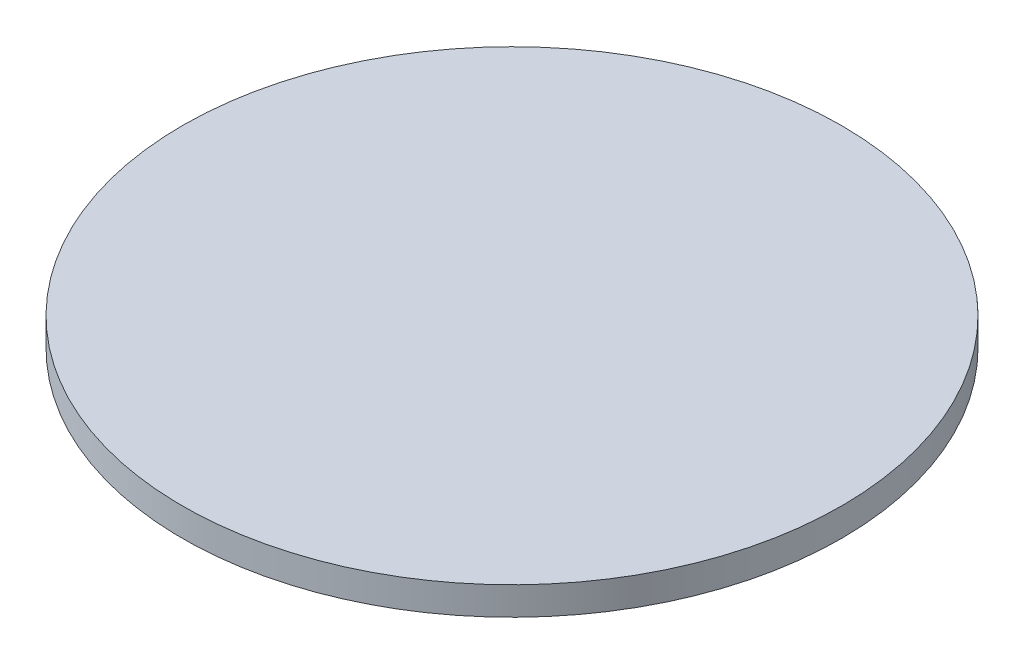
ISO-10303-21;
HEADER;
FILE_DESCRIPTION(('STEP AP214'),'2;1');
FILE_NAME('part.step','',(''),(''),'','','');
FILE_SCHEMA(('AUTOMOTIVE_DESIGN { 1 0 10303 214 1 1 1 1 }'));
ENDSEC;
DATA;
#1=APPLICATION_CONTEXT('core data for automotive mechanical design processes');
#2=APPLICATION_PROTOCOL_DEFINITION('international standard','automotive_design',2000,#1);
#3=PRODUCT_CONTEXT('',#1,'mechanical');
#4=PRODUCT('Part','Part','',(#3));
#5=PRODUCT_RELATED_PRODUCT_CATEGORY('part','',(#4));
#6=PRODUCT_DEFINITION_FORMATION('','',#4);
#7=PRODUCT_DEFINITION_CONTEXT('part definition',#1,'design');
#8=PRODUCT_DEFINITION('design','',#6,#7);
#9=PRODUCT_DEFINITION_SHAPE('','',#8);
#10=(LENGTH_UNIT() NAMED_UNIT(*) SI_UNIT(.MILLI.,.METRE.));
#11=(NAMED_UNIT(*) PLANE_ANGLE_UNIT() SI_UNIT($,.RADIAN.));
#12=(NAMED_UNIT(*) SI_UNIT($,.STERADIAN.) SOLID_ANGLE_UNIT());
#13=UNCERTAINTY_MEASURE_WITH_UNIT(LENGTH_MEASURE(1.E-05),#10,'distance_accuracy_value','');
#14=(GEOMETRIC_REPRESENTATION_CONTEXT(3) GLOBAL_UNCERTAINTY_ASSIGNED_CONTEXT((#13)) GLOBAL_UNIT_ASSIGNED_CONTEXT((#10,
#11,#12)) REPRESENTATION_CONTEXT('',''));
#15=CARTESIAN_POINT('',(0.,0.,0.));
#16=DIRECTION('',(0.,0.,1.));
#17=DIRECTION('',(1.,0.,0.));
#18=AXIS2_PLACEMENT_3D('',#15,#16,#17);
#19=CARTESIAN_POINT('',(70.,19.7581505520302,49.4343145750508));
#20=CARTESIAN_POINT('',(68.6539902023762,19.7581505520302,49.4343145750508));
#21=CARTESIAN_POINT('',(65.9619706071284,19.7581505520302,49.6994553628518));
#22=CARTESIAN_POINT('',(62.0791204192719,19.7581505520302,50.8773050902822));
#23=CARTESIAN_POINT('',(58.5006651916224,19.7581505520302,52.7900292589622));
#24=CARTESIAN_POINT('',(55.3641229517575,19.7581505520302,55.3641229517575));
#25=CARTESIAN_POINT('',(52.7900292589622,19.7581505520302,58.5006651916224));
#26=CARTESIAN_POINT('',(50.8773050902821,19.7581505520302,62.079120419272));
#27=CARTESIAN_POINT('',(49.6994553628517,19.7581505520302,65.9619706071285));
#28=CARTESIAN_POINT('',(49.3017441811503,19.7581505520302,70.));
#29=CARTESIAN_POINT('',(49.6994553628517,19.7581505520302,74.0380293928717));
#30=CARTESIAN_POINT('',(50.8773050902821,19.7581505520302,77.9208795807282));
#31=CARTESIAN_POINT('',(52.7900292589622,19.7581505520302,81.4993348083777));
#32=CARTESIAN_POINT('',(55.3641229517575,19.7581505520302,84.6358770482426));
#33=CARTESIAN_POINT('',(58.5006651916224,19.7581505520302,87.2099707410379));
#34=CARTESIAN_POINT('',(62.0791204192719,19.7581505520302,89.1226949097179));
#35=CARTESIAN_POINT('',(65.9619706071284,19.7581505520302,90.3005446371484));
#36=CARTESIAN_POINT('',(70.,19.7581505520302,90.6982558188498));
#37=CARTESIAN_POINT('',(74.0380293928716,19.7581505520302,90.3005446371484));
#38=CARTESIAN_POINT('',(77.9208795807281,19.7581505520302,89.1226949097179));
#39=CARTESIAN_POINT('',(81.4993348083777,19.7581505520302,87.2099707410379));
#40=CARTESIAN_POINT('',(84.6358770482426,19.7581505520302,84.6358770482426));
#41=CARTESIAN_POINT('',(87.2099707410379,19.7581505520302,81.4993348083777));
#42=CARTESIAN_POINT('',(89.1226949097179,19.7581505520302,77.9208795807281));
#43=CARTESIAN_POINT('',(90.3005446371483,19.7581505520302,74.0380293928717));
#44=CARTESIAN_POINT('',(90.6982558188497,19.7581505520302,70.));
#45=CARTESIAN_POINT('',(90.3005446371483,19.7581505520302,65.9619706071285));
#46=CARTESIAN_POINT('',(89.1226949097179,19.7581505520302,62.079120419272));
#47=CARTESIAN_POINT('',(87.2099707410379,19.7581505520302,58.5006651916224));
#48=CARTESIAN_POINT('',(84.6358770482426,19.7581505520302,55.3641229517575));
#49=CARTESIAN_POINT('',(81.4993348083777,19.7581505520302,52.7900292589622));
#50=CARTESIAN_POINT('',(77.9208795807282,19.7581505520302,50.8773050902822));
#51=CARTESIAN_POINT('',(74.0380293928716,19.7581505520302,49.6994553628518));
#52=CARTESIAN_POINT('',(71.3460097976239,19.7581505520302,49.4343145750508));
#53=CARTESIAN_POINT('',(70.,19.7581505520302,49.4343145750508));
#54=B_SPLINE_CURVE_WITH_KNOTS('',3,(#19,#20,#21,#22,#23,#24,#25,#26,#27,#28,#29,#30,#31,#32,#33,
#34,#35,#36,#37,#38,#39,#40,#41,#42,#43,#44,#45,#46,#47,#48,#49,#50,#51,#52,#53),.UNSPECIFIED.,
.T.,.F.,(4,1,1,1,1,1,1,1,1,1,1,1,1,1,1,1,1,1,1,1,1,1,1,1,1,1,1,1,1,1,1,1,4),(0.,0.03125,0.0625,
0.09375,0.125,0.15625,0.1875,0.21875,0.25,0.28125,0.3125,0.34375,0.375,0.40625,0.4375,0.46875,
0.5,0.53125,0.5625,0.59375,0.625,0.65625,0.6875,0.71875,0.75,0.78125,0.8125,0.84375,0.875,
0.90625,0.9375,0.96875,1.),.UNSPECIFIED.);
#55=DIRECTION('',(0.,-1.,0.));
#56=VECTOR('',#55,1.);
#57=SURFACE_OF_LINEAR_EXTRUSION('',#54,#56);
#58=CARTESIAN_POINT('',(70.0000000000001,19.7581505520302,49.4343145750508));
#59=CARTESIAN_POINT('',(70.3263072681464,19.7581505520302,49.4343147910921));
#60=CARTESIAN_POINT('',(70.652612362683,19.7581505520302,49.4421058398435));
#61=CARTESIAN_POINT('',(71.304485606164,19.7581505520302,49.4731974305585));
#62=CARTESIAN_POINT('',(71.6300537494595,19.7581505520302,49.4964980910066));
#63=CARTESIAN_POINT('',(72.2797156887605,19.7581505520302,49.558536750252));
#64=CARTESIAN_POINT('',(72.6038094838364,19.7581505520302,49.5972747587821));
#65=CARTESIAN_POINT('',(73.2497876834177,19.7581505520302,49.690113558753));
#66=CARTESIAN_POINT('',(73.5716721041321,19.7581505520302,49.7442142373623));
#67=CARTESIAN_POINT('',(74.2124920168201,19.7581505520302,49.8677148164128));
#68=CARTESIAN_POINT('',(74.5314275138688,19.7581505520302,49.937114690518));
#69=CARTESIAN_POINT('',(75.1656368011596,19.7581505520302,50.0910113427244));
#70=CARTESIAN_POINT('',(75.4809105632775,19.7581505520302,50.1755082366978));
#71=CARTESIAN_POINT('',(76.1070892315622,19.7581505520302,50.3593815599823));
#72=CARTESIAN_POINT('',(76.4179941295307,19.7581505520302,50.4587580172119));
#73=CARTESIAN_POINT('',(77.0347285626496,19.7581505520302,50.6721734681364));
#74=CARTESIAN_POINT('',(77.3405581324141,19.7581505520302,50.7862123617864));
#75=CARTESIAN_POINT('',(77.9464277032684,19.7581505520302,51.0287506740943));
#76=CARTESIAN_POINT('',(78.2464677236908,19.7581505520302,51.1572500444556));
#77=CARTESIAN_POINT('',(78.8400914753274,19.7581505520302,51.4283879175557));
#78=CARTESIAN_POINT('',(79.1336751586445,19.7581505520302,51.5710265251449));
#79=CARTESIAN_POINT('',(79.7137366017485,19.7581505520302,51.8700878843361));
#80=CARTESIAN_POINT('',(80.0002143396683,19.7581505520302,52.0265106783491));
#81=CARTESIAN_POINT('',(80.5654130436712,19.7581505520302,52.3527903685812));
#82=CARTESIAN_POINT('',(80.8441340570999,19.7581505520302,52.5226471827771));
#83=CARTESIAN_POINT('',(81.3931578717071,19.7581505520302,52.875458740917));
#84=CARTESIAN_POINT('',(81.663460713045,19.7581505520302,53.058413422363));
#85=CARTESIAN_POINT('',(82.1950455720142,19.7581505520302,53.4369920492456));
#86=CARTESIAN_POINT('',(82.4563275279165,19.7581505520302,53.632616081351));
#87=CARTESIAN_POINT('',(82.9693048641964,19.7581505520302,54.0360550409285));
#88=CARTESIAN_POINT('',(83.2210002042864,19.7581505520302,54.2438700196238));
#89=CARTESIAN_POINT('',(83.7142334591243,19.7581505520302,54.671221604471));
#90=CARTESIAN_POINT('',(83.9557714269024,19.7581505520302,54.8907581494128));
#91=CARTESIAN_POINT('',(84.4281079667064,19.7581505520302,55.3410933973481));
#92=CARTESIAN_POINT('',(84.6589066026521,19.7581505520302,55.5718920332937));
#93=CARTESIAN_POINT('',(85.1092418505874,19.7581505520302,56.0442285730978));
#94=CARTESIAN_POINT('',(85.3287783955292,19.7581505520302,56.2857665408759));
#95=CARTESIAN_POINT('',(85.7561299803764,19.7581505520302,56.7789997957138));
#96=CARTESIAN_POINT('',(85.9639449590717,19.7581505520302,57.0306951358038));
#97=CARTESIAN_POINT('',(86.3673839186492,19.7581505520302,57.5436724720837));
#98=CARTESIAN_POINT('',(86.5630079507545,19.7581505520302,57.8049544279859));
#99=CARTESIAN_POINT('',(86.9415865776371,19.7581505520302,58.3365392869552));
#100=CARTESIAN_POINT('',(87.1245412590832,19.7581505520302,58.6068421282933));
#101=CARTESIAN_POINT('',(87.477352817223,19.7581505520302,59.1558659429001));
#102=CARTESIAN_POINT('',(87.6472096314188,19.7581505520302,59.4345869563284));
#103=CARTESIAN_POINT('',(87.9734893216512,19.7581505520302,59.9997856603325));
#104=CARTESIAN_POINT('',(88.1299121156645,19.7581505520302,60.2862633982541));
#105=CARTESIAN_POINT('',(88.4289734748548,19.7581505520302,60.8663248413533));
#106=CARTESIAN_POINT('',(88.5716120824429,19.7581505520302,61.1599085246639));
#107=CARTESIAN_POINT('',(88.8427499555461,19.7581505520302,61.7535322763184));
#108=CARTESIAN_POINT('',(88.9712493259116,19.7581505520302,62.0535722967651));
#109=CARTESIAN_POINT('',(89.2137876382079,19.7581505520302,62.6594418675527));
#110=CARTESIAN_POINT('',(89.3278265318423,19.7581505520302,62.9652714372261));
#111=CARTESIAN_POINT('',(89.5412419828097,19.7581505520302,63.582005870594));
#112=CARTESIAN_POINT('',(89.6406184400978,19.7581505520302,63.8929107689024));
#113=CARTESIAN_POINT('',(89.8244917632224,19.7581505520302,64.5190894362583));
#114=CARTESIAN_POINT('',(89.9089886569773,19.7581505520302,64.8343631971072));
#115=CARTESIAN_POINT('',(90.0628853097805,19.7581505520302,65.4685724878648));
#116=CARTESIAN_POINT('',(90.1322851847009,19.7581505520302,65.787507989649));
#117=CARTESIAN_POINT('',(90.2557857615241,19.7581505520302,66.4283278893991));
#118=CARTESIAN_POINT('',(90.309886437091,19.7581505520302,66.7502122924402));
#119=CARTESIAN_POINT('',(90.4027252453743,19.7581505520302,67.3961905403063));
#120=CARTESIAN_POINT('',(90.4414632652594,19.7581505520302,67.720284401341));
#121=CARTESIAN_POINT('',(90.5035018934823,19.7581505520302,68.3699461604394));
#122=CARTESIAN_POINT('',(90.5268025115529,19.7581505520302,68.6955140575737));
#123=CARTESIAN_POINT('',(90.5578942180449,19.7581505520302,69.3473879735772));
#124=CARTESIAN_POINT('',(90.5656854249493,19.7581505520302,69.6736939867886));
#125=CARTESIAN_POINT('',(90.5656854249493,19.7581505520302,70.3263060132115));
#126=CARTESIAN_POINT('',(90.5578942180448,19.7581505520302,70.652612026423));
#127=CARTESIAN_POINT('',(90.5268025115528,19.7581505520302,71.3044859424265));
#128=CARTESIAN_POINT('',(90.5035018934822,19.7581505520302,71.6300538395608));
#129=CARTESIAN_POINT('',(90.4414632652593,19.7581505520302,72.2797155986592));
#130=CARTESIAN_POINT('',(90.4027252453742,19.7581505520302,72.6038094596939));
#131=CARTESIAN_POINT('',(90.3098864370909,19.7581505520302,73.24978770756));
#132=CARTESIAN_POINT('',(90.2557857615241,19.7581505520302,73.5716721106011));
#133=CARTESIAN_POINT('',(90.1322851847009,19.7581505520302,74.2124920103512));
#134=CARTESIAN_POINT('',(90.0628853097805,19.7581505520302,74.5314275121354));
#135=CARTESIAN_POINT('',(89.9089886569773,19.7581505520302,75.1656368028929));
#136=CARTESIAN_POINT('',(89.8244917632223,19.7581505520302,75.4809105637419));
#137=CARTESIAN_POINT('',(89.6406184400978,19.7581505520302,76.1070892310978));
#138=CARTESIAN_POINT('',(89.5412419828097,19.7581505520302,76.4179941294062));
#139=CARTESIAN_POINT('',(89.3278265318423,19.7581505520302,77.0347285627741));
#140=CARTESIAN_POINT('',(89.2137876382079,19.7581505520302,77.3405581324475));
#141=CARTESIAN_POINT('',(88.9712493259116,19.7581505520302,77.946427703235));
#142=CARTESIAN_POINT('',(88.8427499555461,19.7581505520302,78.2464677236818));
#143=CARTESIAN_POINT('',(88.5716120824429,19.7581505520302,78.8400914753363));
#144=CARTESIAN_POINT('',(88.4289734748547,19.7581505520302,79.1336751586469));
#145=CARTESIAN_POINT('',(88.1299121156645,19.7581505520302,79.7137366017461));
#146=CARTESIAN_POINT('',(87.9734893216512,19.7581505520302,80.0002143396677));
#147=CARTESIAN_POINT('',(87.6472096314188,19.7581505520302,80.5654130436718));
#148=CARTESIAN_POINT('',(87.477352817223,19.7581505520302,80.8441340571));
#149=CARTESIAN_POINT('',(87.1245412590831,19.7581505520302,81.3931578717069));
#150=CARTESIAN_POINT('',(86.9415865776371,19.7581505520302,81.6634607130449));
#151=CARTESIAN_POINT('',(86.5630079507545,19.7581505520302,82.1950455720143));
#152=CARTESIAN_POINT('',(86.3673839186492,19.7581505520302,82.4563275279165));
#153=CARTESIAN_POINT('',(85.9639449590716,19.7581505520302,82.9693048641964));
#154=CARTESIAN_POINT('',(85.7561299803763,19.7581505520302,83.2210002042864));
#155=CARTESIAN_POINT('',(85.3287783955291,19.7581505520302,83.7142334591243));
#156=CARTESIAN_POINT('',(85.1092418505873,19.7581505520302,83.9557714269024));
#157=CARTESIAN_POINT('',(84.658906602652,19.7581505520302,84.4281079667065));
#158=CARTESIAN_POINT('',(84.4281079667064,19.7581505520302,84.6589066026521));
#159=CARTESIAN_POINT('',(83.9557714269023,19.7581505520302,85.1092418505874));
#160=CARTESIAN_POINT('',(83.7142334591242,19.7581505520302,85.3287783955292));
#161=CARTESIAN_POINT('',(83.2210002042863,19.7581505520302,85.7561299803764));
#162=CARTESIAN_POINT('',(82.9693048641963,19.7581505520302,85.9639449590717));
#163=CARTESIAN_POINT('',(82.4563275279164,19.7581505520302,86.3673839186492));
#164=CARTESIAN_POINT('',(82.1950455720142,19.7581505520302,86.5630079507546));
#165=CARTESIAN_POINT('',(81.6634607130448,19.7581505520302,86.9415865776371));
#166=CARTESIAN_POINT('',(81.3931578717068,19.7581505520302,87.1245412590832));
#167=CARTESIAN_POINT('',(80.8441340571,19.7581505520302,87.477352817223));
#168=CARTESIAN_POINT('',(80.5654130436717,19.7581505520302,87.6472096314188));
#169=CARTESIAN_POINT('',(80.0002143396676,19.7581505520302,87.9734893216512));
#170=CARTESIAN_POINT('',(79.713736601746,19.7581505520302,88.1299121156645));
#171=CARTESIAN_POINT('',(79.1336751586468,19.7581505520302,88.4289734748548));
#172=CARTESIAN_POINT('',(78.8400914753362,19.7581505520302,88.571612082443));
#173=CARTESIAN_POINT('',(78.2464677236817,19.7581505520302,88.8427499555461));
#174=CARTESIAN_POINT('',(77.946427703235,19.7581505520302,88.9712493259116));
#175=CARTESIAN_POINT('',(77.3405581324474,19.7581505520302,89.213787638208));
#176=CARTESIAN_POINT('',(77.034728562774,19.7581505520302,89.3278265318424));
#177=CARTESIAN_POINT('',(76.4179941294061,19.7581505520302,89.5412419828097));
#178=CARTESIAN_POINT('',(76.1070892310977,19.7581505520302,89.6406184400979));
#179=CARTESIAN_POINT('',(75.4809105637418,19.7581505520302,89.8244917632225));
#180=CARTESIAN_POINT('',(75.1656368028929,19.7581505520302,89.9089886569774));
#181=CARTESIAN_POINT('',(74.5314275121354,19.7581505520302,90.0628853097805));
#182=CARTESIAN_POINT('',(74.2124920103511,19.7581505520302,90.132285184701));
#183=CARTESIAN_POINT('',(73.571672110601,19.7581505520302,90.2557857615242));
#184=CARTESIAN_POINT('',(73.2497877075599,19.7581505520302,90.309886437091));
#185=CARTESIAN_POINT('',(72.6038094596938,19.7581505520302,90.4027252453743));
#186=CARTESIAN_POINT('',(72.2797155986591,19.7581505520302,90.4414632652594));
#187=CARTESIAN_POINT('',(71.6300538395607,19.7581505520302,90.5035018934823));
#188=CARTESIAN_POINT('',(71.3044859424264,19.7581505520302,90.5268025115529));
#189=CARTESIAN_POINT('',(70.6526120264229,19.7581505520302,90.5578942180449));
#190=CARTESIAN_POINT('',(70.3263060132114,19.7581505520302,90.5656854249493));
#191=CARTESIAN_POINT('',(69.6736939867885,19.7581505520302,90.5656854249493));
#192=CARTESIAN_POINT('',(69.3473879735771,19.7581505520302,90.5578942180449));
#193=CARTESIAN_POINT('',(68.6955140575736,19.7581505520302,90.5268025115528));
#194=CARTESIAN_POINT('',(68.3699461604393,19.7581505520302,90.5035018934823));
#195=CARTESIAN_POINT('',(67.7202844013409,19.7581505520302,90.4414632652594));
#196=CARTESIAN_POINT('',(67.3961905403062,19.7581505520302,90.4027252453743));
#197=CARTESIAN_POINT('',(66.7502122924401,19.7581505520302,90.309886437091));
#198=CARTESIAN_POINT('',(66.428327889399,19.7581505520302,90.2557857615242));
#199=CARTESIAN_POINT('',(65.7875079896489,19.7581505520302,90.132285184701));
#200=CARTESIAN_POINT('',(65.4685724878647,19.7581505520302,90.0628853097805));
#201=CARTESIAN_POINT('',(64.8343631971071,19.7581505520302,89.9089886569774));
#202=CARTESIAN_POINT('',(64.5190894362582,19.7581505520302,89.8244917632224));
#203=CARTESIAN_POINT('',(63.8929107689023,19.7581505520302,89.6406184400979));
#204=CARTESIAN_POINT('',(63.5820058705939,19.7581505520302,89.5412419828097));
#205=CARTESIAN_POINT('',(62.965271437226,19.7581505520302,89.3278265318424));
#206=CARTESIAN_POINT('',(62.6594418675526,19.7581505520302,89.213787638208));
#207=CARTESIAN_POINT('',(62.053572296765,19.7581505520302,88.9712493259116));
#208=CARTESIAN_POINT('',(61.7535322763183,19.7581505520302,88.8427499555461));
#209=CARTESIAN_POINT('',(61.1599085246638,19.7581505520302,88.5716120824429));
#210=CARTESIAN_POINT('',(60.8663248413532,19.7581505520302,88.4289734748548));
#211=CARTESIAN_POINT('',(60.286263398254,19.7581505520302,88.1299121156645));
#212=CARTESIAN_POINT('',(59.9997856603324,19.7581505520302,87.9734893216512));
#213=CARTESIAN_POINT('',(59.4345869563283,19.7581505520302,87.6472096314188));
#214=CARTESIAN_POINT('',(59.1558659429,19.7581505520302,87.477352817223));
#215=CARTESIAN_POINT('',(58.6068421282932,19.7581505520302,87.1245412590831));
#216=CARTESIAN_POINT('',(58.3365392869552,19.7581505520302,86.9415865776371));
#217=CARTESIAN_POINT('',(57.8049544279858,19.7581505520302,86.5630079507545));
#218=CARTESIAN_POINT('',(57.5436724720836,19.7581505520302,86.3673839186492));
#219=CARTESIAN_POINT('',(57.0306951358037,19.7581505520302,85.9639449590716));
#220=CARTESIAN_POINT('',(56.7789997957137,19.7581505520302,85.7561299803764));
#221=CARTESIAN_POINT('',(56.2857665408758,19.7581505520302,85.3287783955291));
#222=CARTESIAN_POINT('',(56.0442285730977,19.7581505520302,85.1092418505873));
#223=CARTESIAN_POINT('',(55.5718920332936,19.7581505520302,84.658906602652));
#224=CARTESIAN_POINT('',(55.341093397348,19.7581505520302,84.4281079667064));
#225=CARTESIAN_POINT('',(54.8907581494127,19.7581505520302,83.9557714269024));
#226=CARTESIAN_POINT('',(54.6712216044709,19.7581505520302,83.7142334591242));
#227=CARTESIAN_POINT('',(54.2438700196237,19.7581505520302,83.2210002042863));
#228=CARTESIAN_POINT('',(54.0360550409284,19.7581505520302,82.9693048641964));
#229=CARTESIAN_POINT('',(53.6326160813509,19.7581505520302,82.4563275279165));
#230=CARTESIAN_POINT('',(53.4369920492455,19.7581505520302,82.1950455720142));
#231=CARTESIAN_POINT('',(53.058413422363,19.7581505520302,81.6634607130449));
#232=CARTESIAN_POINT('',(52.8754587409169,19.7581505520302,81.3931578717068));
#233=CARTESIAN_POINT('',(52.522647182777,19.7581505520302,80.8441340571));
#234=CARTESIAN_POINT('',(52.3527903685813,19.7581505520302,80.5654130436717));
#235=CARTESIAN_POINT('',(52.0265106783489,19.7581505520302,80.0002143396676));
#236=CARTESIAN_POINT('',(51.8700878843356,19.7581505520302,79.713736601746));
#237=CARTESIAN_POINT('',(51.5710265251453,19.7581505520302,79.1336751586469));
#238=CARTESIAN_POINT('',(51.4283879175571,19.7581505520302,78.8400914753363));
#239=CARTESIAN_POINT('',(51.1572500444539,19.7581505520302,78.2464677236818));
#240=CARTESIAN_POINT('',(51.0287506740885,19.7581505520302,77.946427703235));
#241=CARTESIAN_POINT('',(50.7862123617921,19.7581505520302,77.3405581324474));
#242=CARTESIAN_POINT('',(50.6721734681577,19.7581505520302,77.034728562774));
#243=CARTESIAN_POINT('',(50.4587580171904,19.7581505520302,76.4179941294061));
#244=CARTESIAN_POINT('',(50.3593815599023,19.7581505520302,76.1070892310977));
#245=CARTESIAN_POINT('',(50.1755082367777,19.7581505520302,75.4809105637419));
#246=CARTESIAN_POINT('',(50.0910113430227,19.7581505520302,75.1656368028929));
#247=CARTESIAN_POINT('',(49.9371146902196,19.7581505520302,74.5314275121354));
#248=CARTESIAN_POINT('',(49.8677148152991,19.7581505520302,74.2124920103511));
#249=CARTESIAN_POINT('',(49.7442142384759,19.7581505520302,73.571672110601));
#250=CARTESIAN_POINT('',(49.6901135629091,19.7581505520302,73.2497877075599));
#251=CARTESIAN_POINT('',(49.5972747546258,19.7581505520302,72.6038094596938));
#252=CARTESIAN_POINT('',(49.5585367347407,19.7581505520302,72.2797155986591));
#253=CARTESIAN_POINT('',(49.4964981065178,19.7581505520302,71.6300538395607));
#254=CARTESIAN_POINT('',(49.4731974884472,19.7581505520302,71.3044859424265));
#255=CARTESIAN_POINT('',(49.4421057819552,19.7581505520302,70.6526120264229));
#256=CARTESIAN_POINT('',(49.4343145750508,19.7581505520302,70.3263060132115));
#257=CARTESIAN_POINT('',(49.4343145750508,19.7581505520302,69.6736939867886));
#258=CARTESIAN_POINT('',(49.4421057819552,19.7581505520302,69.3473879735772));
#259=CARTESIAN_POINT('',(49.4731974884472,19.7581505520302,68.6955140575736));
#260=CARTESIAN_POINT('',(49.4964981065178,19.7581505520302,68.3699461604394));
#261=CARTESIAN_POINT('',(49.5585367347407,19.7581505520302,67.7202844013409));
#262=CARTESIAN_POINT('',(49.5972747546258,19.7581505520302,67.3961905403063));
#263=CARTESIAN_POINT('',(49.6901135629091,19.7581505520302,66.7502122924401));
#264=CARTESIAN_POINT('',(49.744214238476,19.7581505520302,66.4283278893991));
#265=CARTESIAN_POINT('',(49.8677148152992,19.7581505520302,65.787507989649));
#266=CARTESIAN_POINT('',(49.9371146902196,19.7581505520302,65.4685724878647));
#267=CARTESIAN_POINT('',(50.0910113430228,19.7581505520302,64.8343631971072));
#268=CARTESIAN_POINT('',(50.1755082367777,19.7581505520302,64.5190894362582));
#269=CARTESIAN_POINT('',(50.3593815599023,19.7581505520302,63.8929107689024));
#270=CARTESIAN_POINT('',(50.4587580171904,19.7581505520302,63.582005870594));
#271=CARTESIAN_POINT('',(50.6721734681577,19.7581505520302,62.9652714372261));
#272=CARTESIAN_POINT('',(50.7862123617921,19.7581505520302,62.6594418675527));
#273=CARTESIAN_POINT('',(51.0287506740885,19.7581505520302,62.0535722967651));
#274=CARTESIAN_POINT('',(51.157250044454,19.7581505520302,61.7535322763183));
#275=CARTESIAN_POINT('',(51.4283879175571,19.7581505520302,61.1599085246638));
#276=CARTESIAN_POINT('',(51.5710265251453,19.7581505520302,60.8663248413532));
#277=CARTESIAN_POINT('',(51.8700878843356,19.7581505520302,60.286263398254));
#278=CARTESIAN_POINT('',(52.0265106783489,19.7581505520302,59.9997856603325));
#279=CARTESIAN_POINT('',(52.3527903685813,19.7581505520302,59.4345869563284));
#280=CARTESIAN_POINT('',(52.5226471827771,19.7581505520302,59.1558659429001));
#281=CARTESIAN_POINT('',(52.8754587409169,19.7581505520302,58.6068421282932));
#282=CARTESIAN_POINT('',(53.058413422363,19.7581505520302,58.3365392869552));
#283=CARTESIAN_POINT('',(53.4369920492455,19.7581505520302,57.8049544279859));
#284=CARTESIAN_POINT('',(53.6326160813509,19.7581505520302,57.5436724720836));
#285=CARTESIAN_POINT('',(54.0360550409284,19.7581505520302,57.0306951358037));
#286=CARTESIAN_POINT('',(54.2438700196237,19.7581505520302,56.7789997957138));
#287=CARTESIAN_POINT('',(54.6712216044709,19.7581505520302,56.2857665408758));
#288=CARTESIAN_POINT('',(54.8907581494128,19.7581505520302,56.0442285730977));
#289=CARTESIAN_POINT('',(55.3410933973481,19.7581505520302,55.5718920332937));
#290=CARTESIAN_POINT('',(55.5718920332937,19.7581505520302,55.341093397348));
#291=CARTESIAN_POINT('',(56.0442285730977,19.7581505520302,54.8907581494127));
#292=CARTESIAN_POINT('',(56.2857665408758,19.7581505520302,54.6712216044709));
#293=CARTESIAN_POINT('',(56.7789997957138,19.7581505520302,54.2438700196237));
#294=CARTESIAN_POINT('',(57.0306951358037,19.7581505520302,54.0360550409285));
#295=CARTESIAN_POINT('',(57.5436724720836,19.7581505520302,53.6326160813509));
#296=CARTESIAN_POINT('',(57.8049544279859,19.7581505520302,53.4369920492455));
#297=CARTESIAN_POINT('',(58.3365392869552,19.7581505520302,53.058413422363));
#298=CARTESIAN_POINT('',(58.6068421282931,19.7581505520302,52.875458740917));
#299=CARTESIAN_POINT('',(59.1558659429003,19.7581505520302,52.522647182777));
#300=CARTESIAN_POINT('',(59.434586956329,19.7581505520302,52.3527903685812));
#301=CARTESIAN_POINT('',(59.9997856603318,19.7581505520302,52.026510678349));
#302=CARTESIAN_POINT('',(60.2862633982517,19.7581505520302,51.870087884336));
#303=CARTESIAN_POINT('',(60.8663248413556,19.7581505520302,51.5710265251449));
#304=CARTESIAN_POINT('',(61.1599085246728,19.7581505520302,51.4283879175556));
#305=CARTESIAN_POINT('',(61.7535322763094,19.7581505520302,51.1572500444555));
#306=CARTESIAN_POINT('',(62.0535722967318,19.7581505520302,51.0287506740942));
#307=CARTESIAN_POINT('',(62.659441867586,19.7581505520302,50.7862123617864));
#308=CARTESIAN_POINT('',(62.9652714373505,19.7581505520302,50.6721734681363));
#309=CARTESIAN_POINT('',(63.5820058704695,19.7581505520302,50.4587580172118));
#310=CARTESIAN_POINT('',(63.8929107684379,19.7581505520302,50.3593815599822));
#311=CARTESIAN_POINT('',(64.5190894367227,19.7581505520302,50.1755082366978));
#312=CARTESIAN_POINT('',(64.8343631988406,19.7581505520302,50.0910113427244));
#313=CARTESIAN_POINT('',(65.4685724861314,19.7581505520302,49.937114690518));
#314=CARTESIAN_POINT('',(65.7875079831801,19.7581505520302,49.8677148164128));
#315=CARTESIAN_POINT('',(66.428327895868,19.7581505520302,49.7442142373623));
#316=CARTESIAN_POINT('',(66.7502123165825,19.7581505520302,49.690113558753));
#317=CARTESIAN_POINT('',(67.3961905161638,19.7581505520302,49.597274758782));
#318=CARTESIAN_POINT('',(67.7202843112396,19.7581505520302,49.558536750252));
#319=CARTESIAN_POINT('',(68.3699462505407,19.7581505520302,49.4964980910066));
#320=CARTESIAN_POINT('',(68.6955143938362,19.7581505520302,49.4731974305585));
#321=CARTESIAN_POINT('',(69.3473876373172,19.7581505520302,49.4421058398435));
#322=CARTESIAN_POINT('',(69.6736927318537,19.7581505520302,49.4343147910921));
#323=CARTESIAN_POINT('',(70.0000000000001,19.7581505520302,49.4343145750508));
#324=B_SPLINE_CURVE_WITH_KNOTS('',3,(#58,#59,#60,#61,#62,#63,#64,#65,#66,#67,#68,#69,#70,#71,
#72,#73,#74,#75,#76,#77,#78,#79,#80,#81,#82,#83,#84,#85,#86,#87,#88,#89,#90,#91,#92,#93,#94,#95,
#96,#97,#98,#99,#100,#101,#102,#103,#104,#105,#106,#107,#108,#109,#110,#111,#112,#113,#114,#115,
#116,#117,#118,#119,#120,#121,#122,#123,#124,#125,#126,#127,#128,#129,#130,#131,#132,#133,#134,
#135,#136,#137,#138,#139,#140,#141,#142,#143,#144,#145,#146,#147,#148,#149,#150,#151,#152,#153,
#154,#155,#156,#157,#158,#159,#160,#161,#162,#163,#164,#165,#166,#167,#168,#169,#170,#171,#172,
#173,#174,#175,#176,#177,#178,#179,#180,#181,#182,#183,#184,#185,#186,#187,#188,#189,#190,#191,
#192,#193,#194,#195,#196,#197,#198,#199,#200,#201,#202,#203,#204,#205,#206,#207,#208,#209,#210,
#211,#212,#213,#214,#215,#216,#217,#218,#219,#220,#221,#222,#223,#224,#225,#226,#227,#228,#229,
#230,#231,#232,#233,#234,#235,#236,#237,#238,#239,#240,#241,#242,#243,#244,#245,#246,#247,#248,
#249,#250,#251,#252,#253,#254,#255,#256,#257,#258,#259,#260,#261,#262,#263,#264,#265,#266,#267,
#268,#269,#270,#271,#272,#273,#274,#275,#276,#277,#278,#279,#280,#281,#282,#283,#284,#285,#286,
#287,#288,#289,#290,#291,#292,#293,#294,#295,#296,#297,#298,#299,#300,#301,#302,#303,#304,#305,
#306,#307,#308,#309,#310,#311,#312,#313,#314,#315,#316,#317,#318,#319,#320,#321,#322,#323),
.UNSPECIFIED.,.F.,.F.,(4,2,2,2,2,2,2,2,2,2,2,2,2,2,2,2,2,2,2,2,2,2,2,2,2,2,2,2,2,2,2,2,2,2,2,2,
2,2,2,2,2,2,2,2,2,2,2,2,2,2,2,2,2,2,2,2,2,2,2,2,2,2,2,2,2,2,2,2,2,2,2,2,2,2,2,2,2,2,2,2,2,2,2,2,
2,2,2,2,2,2,2,2,2,2,2,2,2,2,2,2,2,2,2,2,2,2,2,2,2,2,2,2,2,2,2,2,2,2,2,2,2,2,2,2,2,2,2,2,2,2,2,2,
4),(0.,0.978825977356051,1.95765943246794,2.93649350470556,3.9153203880614,4.89414558648629,
5.8729782978874,6.85181284589415,7.83064071546757,8.8094653159554,9.78829717552483,
10.7671320468657,11.7459609422521,12.7247851673509,13.703616089125,14.6824511239794,
15.6612810478447,16.6401051450423,17.6189350689077,18.597770103762,19.5766010255361,
20.5554252506349,21.5342541460213,22.5130890173622,23.4919208769316,24.4707454774194,
25.4495733469929,26.4284078949996,27.4072406064007,28.3860658048256,29.3648926881815,
30.3437267604191,31.322560215531,32.301386192887,33.280212170243,34.259045625355,
35.2378796975926,36.2167065809484,37.1955317793733,38.1743644907744,39.1531990387811,
40.1320269083546,41.1108515088424,42.0896833684118,43.0685182397527,44.0473471351391,
45.0261713602378,46.005002282012,46.9838373168663,47.9626672407317,48.9414913379293,
49.9203212617947,50.899156296649,51.8779872184232,52.8568114435219,53.8356403389083,
54.8144752102492,55.7933070698186,56.7721316703064,57.7509595398799,58.7297940878866,
59.7086267992877,60.6874519977126,61.6662788810685,62.6451129533061,63.623946408418,
64.602772385774,65.5815983631301,66.560431818242,67.5392658904796,68.5180927738354,
69.4969179722603,70.4757506836614,71.4545852316681,72.4334131012416,73.4122377017294,
74.3910695612988,75.3699044326397,76.3487333280261,77.3275575531248,78.306388474899,
79.2852235097534,80.2640534336187,81.2428775308163,82.2217074546817,83.200542489536,
84.1793734113102,85.158197636409,86.1370265317954,87.1158614031362,88.0946932627057,
89.0735178631935,90.0523457327669,91.0311802807736,92.0100129921747,92.9888381905996,
93.9676650739555,94.9464991461931,95.925332601305,96.904158578661,97.882984556017,
98.861818011129,99.8406520833665,100.819478966722,101.798304165147,102.777136876548,
103.755971424555,104.734799294129,105.713623894616,106.692455754186,107.671290625527,
108.650119520913,109.628943746012,110.607774667786,111.58660970264,112.565439626506,
113.544263723703,114.523093647569,115.501928682423,116.480759604197,117.459583829296,
118.438412724682,119.417247596023,120.396079455593,121.374904056081,122.353731925654,
123.332566473661,124.311399185062,125.290224383487,126.269051266843,127.24788533908,
128.226718794192,129.205544771548),.UNSPECIFIED.);
#325=CARTESIAN_POINT('',(70.0000000000001,19.7581505520302,49.4343145750508));
#326=VERTEX_POINT('',#325);
#327=EDGE_CURVE('E9',#326,#326,#324,.F.);
#328=ORIENTED_EDGE('',*,*,#327,.F.);
#329=EDGE_LOOP('',(#328));
#330=FACE_BOUND('',#329,.T.);
#331=CARTESIAN_POINT('',(70.0000000000001,18.001,49.4343145750508));
#332=CARTESIAN_POINT('',(69.7307969624638,18.001,49.4343145881966));
#333=CARTESIAN_POINT('',(69.4615951016907,18.001,49.4396174320419));
#334=CARTESIAN_POINT('',(68.9236051872752,18.001,49.4607879252073));
#335=CARTESIAN_POINT('',(68.6548171363597,18.001,49.4766556438518));
#336=CARTESIAN_POINT('',(68.1180689318645,18.001,49.5189151010421));
#337=CARTESIAN_POINT('',(67.8501087810865,18.001,49.5453068751622));
#338=CARTESIAN_POINT('',(67.3154297539173,18.001,49.6085737839613));
#339=CARTESIAN_POINT('',(67.0487108733333,18.001,49.6454488832033));
#340=CARTESIAN_POINT('',(66.5169277604632,18.001,49.7296418650299));
#341=CARTESIAN_POINT('',(66.2518635173311,18.001,49.7769596790894));
#342=CARTESIAN_POINT('',(65.7238040985976,18.001,49.8819972285238));
#343=CARTESIAN_POINT('',(65.4608089229963,18.001,49.9397169638987));
#344=CARTESIAN_POINT('',(64.9372861360342,18.001,50.0654373755694));
#345=CARTESIAN_POINT('',(64.6767585408764,18.001,50.1334381193248));
#346=CARTESIAN_POINT('',(64.1585683091875,18.001,50.2795999320645));
#347=CARTESIAN_POINT('',(63.9009056823438,18.001,50.3577610353931));
#348=CARTESIAN_POINT('',(63.3888430987905,18.001,50.5241229974622));
#349=CARTESIAN_POINT('',(63.1344431310551,18.001,50.6123238222645));
#350=CARTESIAN_POINT('',(62.6293033243741,18.001,50.7986447967863));
#351=CARTESIAN_POINT('',(62.3785634614225,18.001,50.8967648814133));
#352=CARTESIAN_POINT('',(61.8811423638571,18.001,51.1028034462343));
#353=CARTESIAN_POINT('',(61.6344611292434,18.001,51.2107219264284));
#354=CARTESIAN_POINT('',(61.1455245219241,18.001,51.4361608846248));
#355=CARTESIAN_POINT('',(60.903269178271,18.001,51.5536814256294));
#356=CARTESIAN_POINT('',(60.4235505815638,18.001,51.7981286793162));
#357=CARTESIAN_POINT('',(60.1860873447112,18.001,51.9250554237929));
#358=CARTESIAN_POINT('',(59.7163195089035,18.001,52.1881192417194));
#359=CARTESIAN_POINT('',(59.4840148925134,18.001,52.3242562840342));
#360=CARTESIAN_POINT('',(59.0249306244833,18.001,52.6055450408261));
#361=CARTESIAN_POINT('',(58.7981509365996,18.001,52.7506966961449));
#362=CARTESIAN_POINT('',(58.3504837759067,18.001,53.0498183298179));
#363=CARTESIAN_POINT('',(58.1295963030975,18.001,53.2037883081721));
#364=CARTESIAN_POINT('',(57.6940354345373,18.001,53.5202823201681));
#365=CARTESIAN_POINT('',(57.4793620795717,18.001,53.6828064099338));
#366=CARTESIAN_POINT('',(57.0565504346235,18.001,54.0161451336935));
#367=CARTESIAN_POINT('',(56.8484121667339,18.001,54.1869597957103));
#368=CARTESIAN_POINT('',(56.4389919931168,18.001,54.5366160744998));
#369=CARTESIAN_POINT('',(56.2377100642152,18.001,54.7154576641372));
#370=CARTESIAN_POINT('',(55.8423236858087,18.001,55.0809044340242));
#371=CARTESIAN_POINT('',(55.6482191892152,18.001,55.267509563323));
#372=CARTESIAN_POINT('',(55.267509563323,18.001,55.6482191892152));
#373=CARTESIAN_POINT('',(55.0809044340242,18.001,55.8423236858087));
#374=CARTESIAN_POINT('',(54.7154576641372,18.001,56.2377100642152));
#375=CARTESIAN_POINT('',(54.5366160744998,18.001,56.4389919931168));
#376=CARTESIAN_POINT('',(54.1869597957103,18.001,56.8484121667339));
#377=CARTESIAN_POINT('',(54.0161451336935,18.001,57.0565504346235));
#378=CARTESIAN_POINT('',(53.6828064099338,18.001,57.4793620795717));
#379=CARTESIAN_POINT('',(53.5202823201681,18.001,57.6940354345373));
#380=CARTESIAN_POINT('',(53.2037883081721,18.001,58.1295963030975));
#381=CARTESIAN_POINT('',(53.0498183298179,18.001,58.3504837759067));
#382=CARTESIAN_POINT('',(52.7506966961449,18.001,58.7981509365996));
#383=CARTESIAN_POINT('',(52.6055450408261,18.001,59.0249306244833));
#384=CARTESIAN_POINT('',(52.3242562840342,18.001,59.4840148925134));
#385=CARTESIAN_POINT('',(52.1881192417194,18.001,59.7163195089035));
#386=CARTESIAN_POINT('',(51.9250554237929,18.001,60.1860873447112));
#387=CARTESIAN_POINT('',(51.7981286793162,18.001,60.4235505815639));
#388=CARTESIAN_POINT('',(51.5536814256294,18.001,60.9032691782709));
#389=CARTESIAN_POINT('',(51.4361608846248,18.001,61.1455245219238));
#390=CARTESIAN_POINT('',(51.2107219264284,18.001,61.6344611292437));
#391=CARTESIAN_POINT('',(51.1028034462343,18.001,61.8811423638584));
#392=CARTESIAN_POINT('',(50.8967648814133,18.001,62.3785634614212));
#393=CARTESIAN_POINT('',(50.7986447967864,18.001,62.6293033243693));
#394=CARTESIAN_POINT('',(50.6123238222644,18.001,63.1344431310599));
#395=CARTESIAN_POINT('',(50.5241229974619,18.001,63.3888430988085));
#396=CARTESIAN_POINT('',(50.3577610353934,18.001,63.9009056823257));
#397=CARTESIAN_POINT('',(50.2795999320658,18.001,64.1585683091201));
#398=CARTESIAN_POINT('',(50.1334381193234,18.001,64.6767585409438));
#399=CARTESIAN_POINT('',(50.0654373755645,18.001,64.9372861362856));
#400=CARTESIAN_POINT('',(49.9397169639035,18.001,65.4608089227449));
#401=CARTESIAN_POINT('',(49.8819972285419,18.001,65.7238040976592));
#402=CARTESIAN_POINT('',(49.7769596790712,18.001,66.2518635182694));
#403=CARTESIAN_POINT('',(49.7296418649621,18.001,66.5169277639654));
#404=CARTESIAN_POINT('',(49.645448883271,18.001,67.0487108698311));
#405=CARTESIAN_POINT('',(49.6085737842142,18.001,67.3154297408469));
#406=CARTESIAN_POINT('',(49.5453068749092,18.001,67.850108794157));
#407=CARTESIAN_POINT('',(49.5189151000983,18.001,68.1180689806443));
#408=CARTESIAN_POINT('',(49.4766556447956,18.001,68.65481708758));
#409=CARTESIAN_POINT('',(49.4607879287297,18.001,68.9236050052274));
#410=CARTESIAN_POINT('',(49.4396174285195,18.001,69.4615952837372));
#411=CARTESIAN_POINT('',(49.4343145750508,18.001,69.7307976418686));
#412=CARTESIAN_POINT('',(49.4343145750508,18.001,70.2692023581314));
#413=CARTESIAN_POINT('',(49.4396174285195,18.001,70.5384047162629));
#414=CARTESIAN_POINT('',(49.4607879287297,18.001,71.0763949947727));
#415=CARTESIAN_POINT('',(49.4766556447956,18.001,71.3451829124201));
#416=CARTESIAN_POINT('',(49.5189151000982,18.001,71.8819310193558));
#417=CARTESIAN_POINT('',(49.5453068749092,18.001,72.1498912058431));
#418=CARTESIAN_POINT('',(49.6085737842142,18.001,72.6845702591532));
#419=CARTESIAN_POINT('',(49.645448883271,18.001,72.951289130169));
#420=CARTESIAN_POINT('',(49.7296418649621,18.001,73.4830722360347));
#421=CARTESIAN_POINT('',(49.7769596790712,18.001,73.7481364817307));
#422=CARTESIAN_POINT('',(49.8819972285419,18.001,74.2761959023409));
#423=CARTESIAN_POINT('',(49.9397169639035,18.001,74.5391910772552));
#424=CARTESIAN_POINT('',(50.0654373755645,18.001,75.0627138637145));
#425=CARTESIAN_POINT('',(50.1334381193234,18.001,75.3232414590563));
#426=CARTESIAN_POINT('',(50.2795999320657,18.001,75.84143169088));
#427=CARTESIAN_POINT('',(50.3577610353934,18.001,76.0990943176744));
#428=CARTESIAN_POINT('',(50.5241229974618,18.001,76.6111569011916));
#429=CARTESIAN_POINT('',(50.6123238222644,18.001,76.8655568689402));
#430=CARTESIAN_POINT('',(50.7986447967864,18.001,77.3706966756308));
#431=CARTESIAN_POINT('',(50.8967648814132,18.001,77.6214365385789));
#432=CARTESIAN_POINT('',(51.1028034462342,18.001,78.1188576361417));
#433=CARTESIAN_POINT('',(51.2107219264284,18.001,78.3655388707563));
#434=CARTESIAN_POINT('',(51.4361608846248,18.001,78.8544754780763));
#435=CARTESIAN_POINT('',(51.5536814256294,18.001,79.0967308217292));
#436=CARTESIAN_POINT('',(51.7981286793162,18.001,79.5764494184362));
#437=CARTESIAN_POINT('',(51.9250554237929,18.001,79.8139126552888));
#438=CARTESIAN_POINT('',(52.1881192417194,18.001,80.2836804910966));
#439=CARTESIAN_POINT('',(52.3242562840341,18.001,80.5159851074867));
#440=CARTESIAN_POINT('',(52.6055450408261,18.001,80.9750693755168));
#441=CARTESIAN_POINT('',(52.7506966961449,18.001,81.2018490634005));
#442=CARTESIAN_POINT('',(53.0498183298179,18.001,81.6495162240934));
#443=CARTESIAN_POINT('',(53.2037883081721,18.001,81.8704036969026));
#444=CARTESIAN_POINT('',(53.5202823201681,18.001,82.3059645654628));
#445=CARTESIAN_POINT('',(53.6828064099338,18.001,82.5206379204284));
#446=CARTESIAN_POINT('',(54.0161451336935,18.001,82.9434495653766));
#447=CARTESIAN_POINT('',(54.1869597957103,18.001,83.1515878332662));
#448=CARTESIAN_POINT('',(54.5366160744998,18.001,83.5610080068832));
#449=CARTESIAN_POINT('',(54.7154576641372,18.001,83.7622899357848));
#450=CARTESIAN_POINT('',(55.0809044340241,18.001,84.1576763141914));
#451=CARTESIAN_POINT('',(55.2675095633229,18.001,84.3517808107849));
#452=CARTESIAN_POINT('',(55.6482191892152,18.001,84.7324904366771));
#453=CARTESIAN_POINT('',(55.8423236858087,18.001,84.9190955659759));
#454=CARTESIAN_POINT('',(56.2377100642152,18.001,85.2845423358629));
#455=CARTESIAN_POINT('',(56.4389919931168,18.001,85.4633839255002));
#456=CARTESIAN_POINT('',(56.8484121667338,18.001,85.8130402042898));
#457=CARTESIAN_POINT('',(57.0565504346234,18.001,85.9838548663066));
#458=CARTESIAN_POINT('',(57.4793620795717,18.001,86.3171935900663));
#459=CARTESIAN_POINT('',(57.6940354345373,18.001,86.479717679832));
#460=CARTESIAN_POINT('',(58.1295963030975,18.001,86.796211691828));
#461=CARTESIAN_POINT('',(58.3504837759067,18.001,86.9501816701822));
#462=CARTESIAN_POINT('',(58.7981509365996,18.001,87.2493033038552));
#463=CARTESIAN_POINT('',(59.0249306244833,18.001,87.394454959174));
#464=CARTESIAN_POINT('',(59.4840148925134,18.001,87.6757437159659));
#465=CARTESIAN_POINT('',(59.7163195089035,18.001,87.8118807582807));
#466=CARTESIAN_POINT('',(60.1860873447112,18.001,88.0749445762072));
#467=CARTESIAN_POINT('',(60.4235505815639,18.001,88.2018713206838));
#468=CARTESIAN_POINT('',(60.9032691782709,18.001,88.4463185743707));
#469=CARTESIAN_POINT('',(61.1455245219237,18.001,88.5638391153752));
#470=CARTESIAN_POINT('',(61.6344611292437,18.001,88.7892780735717));
#471=CARTESIAN_POINT('',(61.8811423638583,18.001,88.8971965537658));
#472=CARTESIAN_POINT('',(62.3785634614211,18.001,89.1032351185868));
#473=CARTESIAN_POINT('',(62.6293033243692,18.001,89.2013552032137));
#474=CARTESIAN_POINT('',(63.1344431310599,18.001,89.3876761777357));
#475=CARTESIAN_POINT('',(63.3888430988085,18.001,89.4758770025382));
#476=CARTESIAN_POINT('',(63.9009056823257,18.001,89.6422389646067));
#477=CARTESIAN_POINT('',(64.1585683091201,18.001,89.7204000679343));
#478=CARTESIAN_POINT('',(64.6767585409438,18.001,89.8665618806767));
#479=CARTESIAN_POINT('',(64.9372861362856,18.001,89.9345626244356));
#480=CARTESIAN_POINT('',(65.4608089227448,18.001,90.0602830360966));
#481=CARTESIAN_POINT('',(65.7238040976591,18.001,90.1180027714582));
#482=CARTESIAN_POINT('',(66.2518635182694,18.001,90.2230403209289));
#483=CARTESIAN_POINT('',(66.5169277639653,18.001,90.2703581350381));
#484=CARTESIAN_POINT('',(67.0487108698311,18.001,90.3545511167291));
#485=CARTESIAN_POINT('',(67.3154297408468,18.001,90.3914262157859));
#486=CARTESIAN_POINT('',(67.8501087941569,18.001,90.4546931250909));
#487=CARTESIAN_POINT('',(68.1180689806442,18.001,90.4810848999018));
#488=CARTESIAN_POINT('',(68.6548170875799,18.001,90.5233443552045));
#489=CARTESIAN_POINT('',(68.9236050052273,18.001,90.5392120712704));
#490=CARTESIAN_POINT('',(69.4615952837372,18.001,90.5603825714806));
#491=CARTESIAN_POINT('',(69.7307976418685,18.001,90.5656854249493));
#492=CARTESIAN_POINT('',(70.2692023581314,18.001,90.5656854249493));
#493=CARTESIAN_POINT('',(70.5384047162628,18.001,90.5603825714806));
#494=CARTESIAN_POINT('',(71.0763949947727,18.001,90.5392120712704));
#495=CARTESIAN_POINT('',(71.34518291242,18.001,90.5233443552045));
#496=CARTESIAN_POINT('',(71.8819310193558,18.001,90.4810848999018));
#497=CARTESIAN_POINT('',(72.1498912058431,18.001,90.4546931250909));
#498=CARTESIAN_POINT('',(72.6845702591532,18.001,90.3914262157859));
#499=CARTESIAN_POINT('',(72.9512891301689,18.001,90.3545511167291));
#500=CARTESIAN_POINT('',(73.4830722360347,18.001,90.2703581350381));
#501=CARTESIAN_POINT('',(73.7481364817306,18.001,90.2230403209289));
#502=CARTESIAN_POINT('',(74.2761959023409,18.001,90.1180027714582));
#503=CARTESIAN_POINT('',(74.5391910772552,18.001,90.0602830360966));
#504=CARTESIAN_POINT('',(75.0627138637144,18.001,89.9345626244356));
#505=CARTESIAN_POINT('',(75.3232414590563,18.001,89.8665618806767));
#506=CARTESIAN_POINT('',(75.8414316908799,18.001,89.7204000679344));
#507=CARTESIAN_POINT('',(76.0990943176743,18.001,89.6422389646067));
#508=CARTESIAN_POINT('',(76.6111569011915,18.001,89.4758770025383));
#509=CARTESIAN_POINT('',(76.8655568689401,18.001,89.3876761777357));
#510=CARTESIAN_POINT('',(77.3706966756308,18.001,89.2013552032138));
#511=CARTESIAN_POINT('',(77.6214365385789,18.001,89.1032351185869));
#512=CARTESIAN_POINT('',(78.1188576361417,18.001,88.8971965537659));
#513=CARTESIAN_POINT('',(78.3655388707563,18.001,88.7892780735717));
#514=CARTESIAN_POINT('',(78.8544754780763,18.001,88.5638391153753));
#515=CARTESIAN_POINT('',(79.0967308217291,18.001,88.4463185743707));
#516=CARTESIAN_POINT('',(79.5764494184361,18.001,88.2018713206839));
#517=CARTESIAN_POINT('',(79.8139126552888,18.001,88.0749445762072));
#518=CARTESIAN_POINT('',(80.2836804910965,18.001,87.8118807582807));
#519=CARTESIAN_POINT('',(80.5159851074866,18.001,87.675743715966));
#520=CARTESIAN_POINT('',(80.9750693755167,18.001,87.394454959174));
#521=CARTESIAN_POINT('',(81.2018490634004,18.001,87.2493033038552));
#522=CARTESIAN_POINT('',(81.6495162240933,18.001,86.9501816701822));
#523=CARTESIAN_POINT('',(81.8704036969025,18.001,86.796211691828));
#524=CARTESIAN_POINT('',(82.3059645654627,18.001,86.479717679832));
#525=CARTESIAN_POINT('',(82.5206379204284,18.001,86.3171935900663));
#526=CARTESIAN_POINT('',(82.9434495653766,18.001,85.9838548663066));
#527=CARTESIAN_POINT('',(83.1515878332662,18.001,85.8130402042898));
#528=CARTESIAN_POINT('',(83.5610080068832,18.001,85.4633839255003));
#529=CARTESIAN_POINT('',(83.7622899357848,18.001,85.284542335863));
#530=CARTESIAN_POINT('',(84.1576763141913,18.001,84.919095565976));
#531=CARTESIAN_POINT('',(84.3517808107848,18.001,84.7324904366772));
#532=CARTESIAN_POINT('',(84.7324904366771,18.001,84.3517808107849));
#533=CARTESIAN_POINT('',(84.9190955659759,18.001,84.1576763141914));
#534=CARTESIAN_POINT('',(85.2845423358629,18.001,83.7622899357849));
#535=CARTESIAN_POINT('',(85.4633839255002,18.001,83.5610080068833));
#536=CARTESIAN_POINT('',(85.8130402042897,18.001,83.1515878332663));
#537=CARTESIAN_POINT('',(85.9838548663065,18.001,82.9434495653767));
#538=CARTESIAN_POINT('',(86.3171935900663,18.001,82.5206379204285));
#539=CARTESIAN_POINT('',(86.4797176798319,18.001,82.3059645654628));
#540=CARTESIAN_POINT('',(86.796211691828,18.001,81.8704036969026));
#541=CARTESIAN_POINT('',(86.9501816701821,18.001,81.6495162240934));
#542=CARTESIAN_POINT('',(87.2493033038551,18.001,81.2018490634005));
#543=CARTESIAN_POINT('',(87.3944549591739,18.001,80.9750693755168));
#544=CARTESIAN_POINT('',(87.6757437159659,18.001,80.5159851074868));
#545=CARTESIAN_POINT('',(87.8118807582806,18.001,80.2836804910966));
#546=CARTESIAN_POINT('',(88.0749445762071,18.001,79.8139126552889));
#547=CARTESIAN_POINT('',(88.2018713206838,18.001,79.5764494184362));
#548=CARTESIAN_POINT('',(88.4463185743706,18.001,79.0967308217292));
#549=CARTESIAN_POINT('',(88.5638391153752,18.001,78.8544754780764));
#550=CARTESIAN_POINT('',(88.7892780735717,18.001,78.3655388707564));
#551=CARTESIAN_POINT('',(88.8971965537658,18.001,78.1188576361418));
#552=CARTESIAN_POINT('',(89.1032351185868,18.001,77.621436538579));
#553=CARTESIAN_POINT('',(89.2013552032137,18.001,77.3706966756309));
#554=CARTESIAN_POINT('',(89.3876761777356,18.001,76.8655568689402));
#555=CARTESIAN_POINT('',(89.4758770025382,18.001,76.6111569011916));
#556=CARTESIAN_POINT('',(89.6422389646066,18.001,76.0990943176744));
#557=CARTESIAN_POINT('',(89.7204000679343,18.001,75.84143169088));
#558=CARTESIAN_POINT('',(89.8665618806766,18.001,75.3232414590564));
#559=CARTESIAN_POINT('',(89.9345626244355,18.001,75.0627138637145));
#560=CARTESIAN_POINT('',(90.0602830360965,18.001,74.5391910772553));
#561=CARTESIAN_POINT('',(90.1180027714581,18.001,74.276195902341));
#562=CARTESIAN_POINT('',(90.2230403209288,18.001,73.7481364817307));
#563=CARTESIAN_POINT('',(90.270358135038,18.001,73.4830722360348));
#564=CARTESIAN_POINT('',(90.354551116729,18.001,72.951289130169));
#565=CARTESIAN_POINT('',(90.3914262157858,18.001,72.6845702591533));
#566=CARTESIAN_POINT('',(90.4546931250908,18.001,72.1498912058432));
#567=CARTESIAN_POINT('',(90.4810848999018,18.001,71.8819310193559));
#568=CARTESIAN_POINT('',(90.5233443552045,18.001,71.3451829124201));
#569=CARTESIAN_POINT('',(90.5392120712704,18.001,71.0763949947728));
#570=CARTESIAN_POINT('',(90.5603825714806,18.001,70.5384047162629));
#571=CARTESIAN_POINT('',(90.5656854249493,18.001,70.2692023581315));
#572=CARTESIAN_POINT('',(90.5656854249493,18.001,69.7307976418687));
#573=CARTESIAN_POINT('',(90.5603825714806,18.001,69.4615952837373));
#574=CARTESIAN_POINT('',(90.5392120712704,18.001,68.9236050052274));
#575=CARTESIAN_POINT('',(90.5233443552045,18.001,68.65481708758));
#576=CARTESIAN_POINT('',(90.4810848999018,18.001,68.1180689806443));
#577=CARTESIAN_POINT('',(90.4546931250908,18.001,67.850108794157));
#578=CARTESIAN_POINT('',(90.3914262157859,18.001,67.3154297408469));
#579=CARTESIAN_POINT('',(90.3545511167291,18.001,67.0487108698312));
#580=CARTESIAN_POINT('',(90.270358135038,18.001,66.5169277639654));
#581=CARTESIAN_POINT('',(90.2230403209289,18.001,66.2518635182695));
#582=CARTESIAN_POINT('',(90.1180027714582,18.001,65.7238040976592));
#583=CARTESIAN_POINT('',(90.0602830360966,18.001,65.4608089227449));
#584=CARTESIAN_POINT('',(89.9345626244356,18.001,64.9372861362857));
#585=CARTESIAN_POINT('',(89.8665618806766,18.001,64.6767585409439));
#586=CARTESIAN_POINT('',(89.7204000679343,18.001,64.1585683091202));
#587=CARTESIAN_POINT('',(89.6422389646067,18.001,63.9009056823258));
#588=CARTESIAN_POINT('',(89.4758770025382,18.001,63.3888430988086));
#589=CARTESIAN_POINT('',(89.3876761777357,18.001,63.13444313106));
#590=CARTESIAN_POINT('',(89.2013552032137,18.001,62.6293033243693));
#591=CARTESIAN_POINT('',(89.1032351185868,18.001,62.3785634614212));
#592=CARTESIAN_POINT('',(88.8971965537658,18.001,61.8811423638585));
#593=CARTESIAN_POINT('',(88.7892780735717,18.001,61.6344611292438));
#594=CARTESIAN_POINT('',(88.5638391153753,18.001,61.1455245219238));
#595=CARTESIAN_POINT('',(88.4463185743707,18.001,60.903269178271));
#596=CARTESIAN_POINT('',(88.2018713206839,18.001,60.423550581564));
#597=CARTESIAN_POINT('',(88.0749445762072,18.001,60.1860873447113));
#598=CARTESIAN_POINT('',(87.8118807582807,18.001,59.7163195089035));
#599=CARTESIAN_POINT('',(87.6757437159659,18.001,59.4840148925134));
#600=CARTESIAN_POINT('',(87.394454959174,18.001,59.0249306244834));
#601=CARTESIAN_POINT('',(87.2493033038552,18.001,58.7981509365997));
#602=CARTESIAN_POINT('',(86.9501816701822,18.001,58.3504837759068));
#603=CARTESIAN_POINT('',(86.796211691828,18.001,58.1295963030976));
#604=CARTESIAN_POINT('',(86.4797176798319,18.001,57.6940354345374));
#605=CARTESIAN_POINT('',(86.3171935900663,18.001,57.4793620795717));
#606=CARTESIAN_POINT('',(85.9838548663066,18.001,57.0565504346235));
#607=CARTESIAN_POINT('',(85.8130402042898,18.001,56.8484121667339));
#608=CARTESIAN_POINT('',(85.4633839255003,18.001,56.4389919931169));
#609=CARTESIAN_POINT('',(85.2845423358629,18.001,56.2377100642153));
#610=CARTESIAN_POINT('',(84.919095565976,18.001,55.8423236858088));
#611=CARTESIAN_POINT('',(84.7324904366772,18.001,55.6482191892153));
#612=CARTESIAN_POINT('',(84.3517808107849,18.001,55.267509563323));
#613=CARTESIAN_POINT('',(84.1576763141914,18.001,55.0809044340242));
#614=CARTESIAN_POINT('',(83.7622899357849,18.001,54.7154576641372));
#615=CARTESIAN_POINT('',(83.5610080068833,18.001,54.5366160744999));
#616=CARTESIAN_POINT('',(83.1515878332662,18.001,54.1869597957104));
#617=CARTESIAN_POINT('',(82.9434495653767,18.001,54.0161451336936));
#618=CARTESIAN_POINT('',(82.5206379204284,18.001,53.6828064099338));
#619=CARTESIAN_POINT('',(82.3059645654628,18.001,53.5202823201682));
#620=CARTESIAN_POINT('',(81.8704036969026,18.001,53.2037883081721));
#621=CARTESIAN_POINT('',(81.6495162240934,18.001,53.0498183298179));
#622=CARTESIAN_POINT('',(81.2018490634005,18.001,52.7506966961449));
#623=CARTESIAN_POINT('',(80.9750693755168,18.001,52.6055450408262));
#624=CARTESIAN_POINT('',(80.5159851074867,18.001,52.3242562840342));
#625=CARTESIAN_POINT('',(80.2836804910966,18.001,52.1881192417194));
#626=CARTESIAN_POINT('',(79.8139126552889,18.001,51.9250554237929));
#627=CARTESIAN_POINT('',(79.5764494184363,18.001,51.7981286793163));
#628=CARTESIAN_POINT('',(79.0967308217291,18.001,51.5536814256294));
#629=CARTESIAN_POINT('',(78.854475478076,18.001,51.4361608846249));
#630=CARTESIAN_POINT('',(78.3655388707568,18.001,51.2107219264284));
#631=CARTESIAN_POINT('',(78.118857636143,18.001,51.1028034462343));
#632=CARTESIAN_POINT('',(77.6214365385777,18.001,50.8967648814133));
#633=CARTESIAN_POINT('',(77.370696675626,18.001,50.7986447967863));
#634=CARTESIAN_POINT('',(76.8655568689451,18.001,50.6123238222646));
#635=CARTESIAN_POINT('',(76.6111569012097,18.001,50.5241229974622));
#636=CARTESIAN_POINT('',(76.0990943176564,18.001,50.3577610353931));
#637=CARTESIAN_POINT('',(75.8414316908126,18.001,50.2795999320645));
#638=CARTESIAN_POINT('',(75.3232414591237,18.001,50.1334381193248));
#639=CARTESIAN_POINT('',(75.062713863966,18.001,50.0654373755694));
#640=CARTESIAN_POINT('',(74.5391910770038,18.001,49.9397169638987));
#641=CARTESIAN_POINT('',(74.2761959014025,18.001,49.8819972285238));
#642=CARTESIAN_POINT('',(73.7481364826691,18.001,49.7769596790894));
#643=CARTESIAN_POINT('',(73.4830722395369,18.001,49.7296418650299));
#644=CARTESIAN_POINT('',(72.9512891266668,18.001,49.6454488832033));
#645=CARTESIAN_POINT('',(72.6845702460828,18.001,49.6085737839613));
#646=CARTESIAN_POINT('',(72.1498912189137,18.001,49.5453068751622));
#647=CARTESIAN_POINT('',(71.8819310681356,18.001,49.5189151010421));
#648=CARTESIAN_POINT('',(71.3451828636405,18.001,49.4766556438518));
#649=CARTESIAN_POINT('',(71.076394812725,18.001,49.4607879252073));
#650=CARTESIAN_POINT('',(70.5384048983094,18.001,49.4396174320419));
#651=CARTESIAN_POINT('',(70.2692030375363,18.001,49.4343145881966));
#652=CARTESIAN_POINT('',(70.0000000000001,18.001,49.4343145750508));
#653=B_SPLINE_CURVE_WITH_KNOTS('',3,(#331,#332,#333,#334,#335,#336,#337,#338,#339,#340,#341,
#342,#343,#344,#345,#346,#347,#348,#349,#350,#351,#352,#353,#354,#355,#356,#357,#358,#359,#360,
#361,#362,#363,#364,#365,#366,#367,#368,#369,#370,#371,#372,#373,#374,#375,#376,#377,#378,#379,
#380,#381,#382,#383,#384,#385,#386,#387,#388,#389,#390,#391,#392,#393,#394,#395,#396,#397,#398,
#399,#400,#401,#402,#403,#404,#405,#406,#407,#408,#409,#410,#411,#412,#413,#414,#415,#416,#417,
#418,#419,#420,#421,#422,#423,#424,#425,#426,#427,#428,#429,#430,#431,#432,#433,#434,#435,#436,
#437,#438,#439,#440,#441,#442,#443,#444,#445,#446,#447,#448,#449,#450,#451,#452,#453,#454,#455,
#456,#457,#458,#459,#460,#461,#462,#463,#464,#465,#466,#467,#468,#469,#470,#471,#472,#473,#474,
#475,#476,#477,#478,#479,#480,#481,#482,#483,#484,#485,#486,#487,#488,#489,#490,#491,#492,#493,
#494,#495,#496,#497,#498,#499,#500,#501,#502,#503,#504,#505,#506,#507,#508,#509,#510,#511,#512,
#513,#514,#515,#516,#517,#518,#519,#520,#521,#522,#523,#524,#525,#526,#527,#528,#529,#530,#531,
#532,#533,#534,#535,#536,#537,#538,#539,#540,#541,#542,#543,#544,#545,#546,#547,#548,#549,#550,
#551,#552,#553,#554,#555,#556,#557,#558,#559,#560,#561,#562,#563,#564,#565,#566,#567,#568,#569,
#570,#571,#572,#573,#574,#575,#576,#577,#578,#579,#580,#581,#582,#583,#584,#585,#586,#587,#588,
#589,#590,#591,#592,#593,#594,#595,#596,#597,#598,#599,#600,#601,#602,#603,#604,#605,#606,#607,
#608,#609,#610,#611,#612,#613,#614,#615,#616,#617,#618,#619,#620,#621,#622,#623,#624,#625,#626,
#627,#628,#629,#630,#631,#632,#633,#634,#635,#636,#637,#638,#639,#640,#641,#642,#643,#644,#645,
#646,#647,#648,#649,#650,#651,#652),.UNSPECIFIED.,.F.,.F.,(4,2,2,2,2,2,2,2,2,2,2,2,2,2,2,2,2,2,
2,2,2,2,2,2,2,2,2,2,2,2,2,2,2,2,2,2,2,2,2,2,2,2,2,2,2,2,2,2,2,2,2,2,2,2,2,2,2,2,2,2,2,2,2,2,2,2,
2,2,2,2,2,2,2,2,2,2,2,2,2,2,2,2,2,2,2,2,2,2,2,2,2,2,2,2,2,2,2,2,2,2,2,2,2,2,2,2,2,2,2,2,2,2,2,2,
2,2,2,2,2,2,2,2,2,2,2,2,2,2,2,2,2,2,2,2,2,2,2,2,2,2,2,2,2,2,2,2,2,2,2,2,2,2,2,2,2,2,2,2,2,2,4),
(0.,0.807555281253738,1.61511586156482,2.42267917167983,3.23023975199092,4.03779503324465,
4.84535031449842,5.65291089480952,6.4604742049245,7.26803478523559,8.07559006648934,
8.88314534774307,9.69070592805417,10.4982692381692,11.3058298184803,12.113385099734,
12.9209403809877,13.7285009612988,14.5360642714138,15.3436248517249,16.1511801329787,
16.9587354142324,17.7662959945435,18.5738593046585,19.3814198849696,20.1889751662233,
20.9965304474771,21.8040910277882,22.6116543379032,23.4192149182143,24.226770199468,
25.0343254807217,25.8418860610328,26.6494493711478,27.4570099514589,28.2645652327127,
29.0721205139664,29.8796810942775,30.6872444043925,31.4948049847036,32.3023602659573,
33.1099155472111,33.9174761275221,34.7250394376372,35.5326000179482,36.340155299202,
37.1477105804557,37.9552711607668,38.7628344708818,39.5703950511929,40.3779503324466,
41.1855056137004,41.9930661940115,42.8006295041264,43.6081900844376,44.4157453656913,
45.223300646945,46.0308612272562,46.8384245373711,47.6459851176822,48.453540398936,
49.2610956801897,50.0686562605008,50.8762195706158,51.6837801509269,52.4913354321806,
53.2988907134344,54.1064512937455,54.9140146038604,55.7215751841715,56.5291304654253,
57.336685746679,58.1442463269901,58.9518096371051,59.7593702174162,60.5669254986699,
61.3744807799237,62.1820413602348,62.9896046703497,63.7971652506608,64.6047205319145,
65.4122758131683,66.2198363934794,67.0273997035944,67.8349602839055,68.6425155651593,
69.450070846413,70.2576314267241,71.0651947368391,71.8727553171502,72.6803105984039,
73.4878658796577,74.2954264599687,75.1029897700837,75.9105503503948,76.7181056316486,
77.5256609129023,78.3332214932134,79.1407848033284,79.9483453836395,80.7559006648932,
81.563455946147,82.3710165264581,83.178579836573,83.9861404168842,84.7936956981379,
85.6012509793916,86.4088115597027,87.2163748698177,88.0239354501288,88.8314907313825,
89.6390460126363,90.4466065929474,91.2541699030623,92.0617304833735,92.8692857646272,
93.6768410458809,94.4844016261921,95.2919649363071,96.0995255166182,96.9070807978719,
97.7146360791256,98.5221966594367,99.3297599695517,100.137320549863,100.944875831117,
101.75243111237,102.559991692681,103.367555002796,104.175115583107,104.982670864361,
105.790226145615,106.597786725926,107.405350036041,108.212910616352,109.020465897606,
109.82802117886,110.635581759171,111.443145069286,112.250705649597,113.058260930851,
113.865816212104,114.673376792415,115.48094010253,116.288500682841,117.096055964095,
117.903611245349,118.71117182566,119.518735135775,120.326295716086,121.13385099734,
121.941406278594,122.748966858905,123.55653016902,124.364090749331,125.171646030585,
125.979201311838,126.786761892149,127.594325202264,128.401885782576,129.209441063829),.UNSPECIFIED.);
#654=CARTESIAN_POINT('',(70.0000000000001,18.001,49.4343145750508));
#655=VERTEX_POINT('',#654);
#656=EDGE_CURVE('E24',#655,#655,#653,.T.);
#657=ORIENTED_EDGE('',*,*,#656,.T.);
#658=EDGE_LOOP('',(#657));
#659=FACE_BOUND('',#658,.T.);
#660=ADVANCED_FACE('F14',(#330,#659),#57,.F.);
#661=CARTESIAN_POINT('',(70.,19.7581505520302,47.0000000000001));
#662=DIRECTION('',(0.,-1.,0.));
#663=DIRECTION('',(1.,0.,0.));
#664=AXIS2_PLACEMENT_3D('',#661,#662,#663);
#665=PLANE('',#664);
#666=ORIENTED_EDGE('',*,*,#327,.T.);
#667=EDGE_LOOP('',(#666));
#668=FACE_BOUND('',#667,.T.);
#669=ADVANCED_FACE('F59',(#668),#665,.F.);
#670=CARTESIAN_POINT('',(70.,18.001,47.0000000000001));
#671=DIRECTION('',(0.,-1.,0.));
#672=DIRECTION('',(1.,0.,0.));
#673=AXIS2_PLACEMENT_3D('',#670,#671,#672);
#674=PLANE('',#673);
#675=ORIENTED_EDGE('',*,*,#656,.F.);
#676=EDGE_LOOP('',(#675));
#677=FACE_BOUND('',#676,.T.);
#678=ADVANCED_FACE('F67',(#677),#674,.T.);
#679=CLOSED_SHELL('',(#660,#669,#678));
#680=MANIFOLD_SOLID_BREP('B1',#679);
#681=ADVANCED_BREP_SHAPE_REPRESENTATION('',(#18,#680),#14);
#682=SHAPE_DEFINITION_REPRESENTATION(#9,#681);
ENDSEC;
END-ISO-10303-21;
